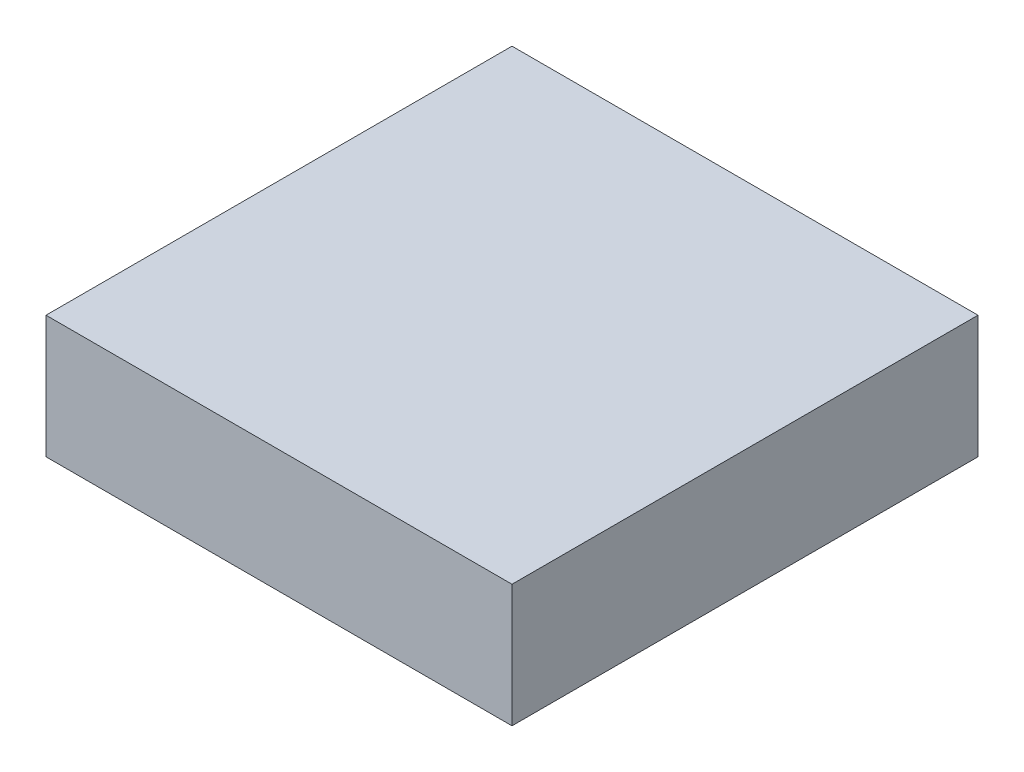
ISO-10303-21;
HEADER;
FILE_DESCRIPTION(('STEP AP214'),'2;1');
FILE_NAME('part.step','',(''),(''),'','','');
FILE_SCHEMA(('AUTOMOTIVE_DESIGN { 1 0 10303 214 1 1 1 1 }'));
ENDSEC;
DATA;
#1=APPLICATION_CONTEXT('core data for automotive mechanical design processes');
#2=APPLICATION_PROTOCOL_DEFINITION('international standard','automotive_design',2000,#1);
#3=PRODUCT_CONTEXT('',#1,'mechanical');
#4=PRODUCT('Part','Part','',(#3));
#5=PRODUCT_RELATED_PRODUCT_CATEGORY('part','',(#4));
#6=PRODUCT_DEFINITION_FORMATION('','',#4);
#7=PRODUCT_DEFINITION_CONTEXT('part definition',#1,'design');
#8=PRODUCT_DEFINITION('design','',#6,#7);
#9=PRODUCT_DEFINITION_SHAPE('','',#8);
#10=(LENGTH_UNIT() NAMED_UNIT(*) SI_UNIT(.MILLI.,.METRE.));
#11=(NAMED_UNIT(*) PLANE_ANGLE_UNIT() SI_UNIT($,.RADIAN.));
#12=(NAMED_UNIT(*) SI_UNIT($,.STERADIAN.) SOLID_ANGLE_UNIT());
#13=UNCERTAINTY_MEASURE_WITH_UNIT(LENGTH_MEASURE(1.E-05),#10,'distance_accuracy_value','');
#14=(GEOMETRIC_REPRESENTATION_CONTEXT(3) GLOBAL_UNCERTAINTY_ASSIGNED_CONTEXT((#13)) GLOBAL_UNIT_ASSIGNED_CONTEXT((#10,
#11,#12)) REPRESENTATION_CONTEXT('',''));
#15=CARTESIAN_POINT('',(0.,0.,0.));
#16=DIRECTION('',(0.,0.,1.));
#17=DIRECTION('',(1.,0.,0.));
#18=AXIS2_PLACEMENT_3D('',#15,#16,#17);
#19=CARTESIAN_POINT('',(28.5,15.,-28.5));
#20=DIRECTION('',(-1.,0.,0.));
#21=DIRECTION('',(0.,0.,1.));
#22=AXIS2_PLACEMENT_3D('',#19,#20,#21);
#23=PLANE('',#22);
#24=DIRECTION('',(0.,0.,-1.));
#25=VECTOR('',#24,1.);
#26=CARTESIAN_POINT('',(28.5,0.,-28.5));
#27=LINE('',#26,#25);
#28=CARTESIAN_POINT('',(28.5,0.,28.5));
#29=VERTEX_POINT('',#28);
#30=CARTESIAN_POINT('',(28.5,0.,-28.5));
#31=VERTEX_POINT('',#30);
#32=EDGE_CURVE('E107',#29,#31,#27,.T.);
#33=ORIENTED_EDGE('',*,*,#32,.T.);
#34=DIRECTION('',(0.,-1.,0.));
#35=VECTOR('',#34,1.);
#36=CARTESIAN_POINT('',(28.5,15.,-28.5));
#37=LINE('',#36,#35);
#38=CARTESIAN_POINT('',(28.5,15.,-28.5));
#39=VERTEX_POINT('',#38);
#40=EDGE_CURVE('E11',#39,#31,#37,.T.);
#41=ORIENTED_EDGE('',*,*,#40,.F.);
#42=DIRECTION('',(0.,0.,-1.));
#43=VECTOR('',#42,1.);
#44=CARTESIAN_POINT('',(28.5,15.,-28.5));
#45=LINE('',#44,#43);
#46=CARTESIAN_POINT('',(28.5,15.,28.5));
#47=VERTEX_POINT('',#46);
#48=EDGE_CURVE('E91',#47,#39,#45,.T.);
#49=ORIENTED_EDGE('',*,*,#48,.F.);
#50=DIRECTION('',(0.,-1.,0.));
#51=VECTOR('',#50,1.);
#52=CARTESIAN_POINT('',(28.5,15.,28.5));
#53=LINE('',#52,#51);
#54=EDGE_CURVE('E103',#47,#29,#53,.T.);
#55=ORIENTED_EDGE('',*,*,#54,.T.);
#56=EDGE_LOOP('',(#33,#41,#49,#55));
#57=FACE_BOUND('',#56,.T.);
#58=ADVANCED_FACE('F39',(#57),#23,.F.);
#59=CARTESIAN_POINT('',(-28.5,15.,-28.5));
#60=DIRECTION('',(0.,0.,1.));
#61=DIRECTION('',(1.,0.,0.));
#62=AXIS2_PLACEMENT_3D('',#59,#60,#61);
#63=PLANE('',#62);
#64=DIRECTION('',(-1.,0.,0.));
#65=VECTOR('',#64,1.);
#66=CARTESIAN_POINT('',(-28.5,0.,-28.5));
#67=LINE('',#66,#65);
#68=CARTESIAN_POINT('',(-28.5,0.,-28.5));
#69=VERTEX_POINT('',#68);
#70=EDGE_CURVE('E96',#31,#69,#67,.T.);
#71=ORIENTED_EDGE('',*,*,#70,.T.);
#72=DIRECTION('',(0.,-1.,0.));
#73=VECTOR('',#72,1.);
#74=CARTESIAN_POINT('',(-28.5,15.,-28.5));
#75=LINE('',#74,#73);
#76=CARTESIAN_POINT('',(-28.5,15.,-28.5));
#77=VERTEX_POINT('',#76);
#78=EDGE_CURVE('E48',#77,#69,#75,.T.);
#79=ORIENTED_EDGE('',*,*,#78,.F.);
#80=DIRECTION('',(-1.,0.,0.));
#81=VECTOR('',#80,1.);
#82=CARTESIAN_POINT('',(-28.5,15.,-28.5));
#83=LINE('',#82,#81);
#84=EDGE_CURVE('E86',#39,#77,#83,.T.);
#85=ORIENTED_EDGE('',*,*,#84,.F.);
#86=ORIENTED_EDGE('',*,*,#40,.T.);
#87=EDGE_LOOP('',(#71,#79,#85,#86));
#88=FACE_BOUND('',#87,.T.);
#89=ADVANCED_FACE('F95',(#88),#63,.F.);
#90=CARTESIAN_POINT('',(-28.5,15.,-28.5));
#91=DIRECTION('',(1.,0.,0.));
#92=DIRECTION('',(0.,0.,-1.));
#93=AXIS2_PLACEMENT_3D('',#90,#91,#92);
#94=PLANE('',#93);
#95=DIRECTION('',(0.,0.,1.));
#96=VECTOR('',#95,1.);
#97=CARTESIAN_POINT('',(-28.5,0.,-28.5));
#98=LINE('',#97,#96);
#99=CARTESIAN_POINT('',(-28.5,0.,28.5));
#100=VERTEX_POINT('',#99);
#101=EDGE_CURVE('E73',#69,#100,#98,.T.);
#102=ORIENTED_EDGE('',*,*,#101,.T.);
#103=DIRECTION('',(0.,-1.,0.));
#104=VECTOR('',#103,1.);
#105=CARTESIAN_POINT('',(-28.5,15.,28.5));
#106=LINE('',#105,#104);
#107=CARTESIAN_POINT('',(-28.5,15.,28.5));
#108=VERTEX_POINT('',#107);
#109=EDGE_CURVE('E98',#108,#100,#106,.T.);
#110=ORIENTED_EDGE('',*,*,#109,.F.);
#111=DIRECTION('',(0.,0.,1.));
#112=VECTOR('',#111,1.);
#113=CARTESIAN_POINT('',(-28.5,15.,-28.5));
#114=LINE('',#113,#112);
#115=EDGE_CURVE('E89',#77,#108,#114,.T.);
#116=ORIENTED_EDGE('',*,*,#115,.F.);
#117=ORIENTED_EDGE('',*,*,#78,.T.);
#118=EDGE_LOOP('',(#102,#110,#116,#117));
#119=FACE_BOUND('',#118,.T.);
#120=ADVANCED_FACE('F99',(#119),#94,.F.);
#121=CARTESIAN_POINT('',(-28.5,15.,28.5));
#122=DIRECTION('',(0.,0.,-1.));
#123=DIRECTION('',(-1.,0.,0.));
#124=AXIS2_PLACEMENT_3D('',#121,#122,#123);
#125=PLANE('',#124);
#126=DIRECTION('',(1.,0.,0.));
#127=VECTOR('',#126,1.);
#128=CARTESIAN_POINT('',(-28.5,0.,28.5));
#129=LINE('',#128,#127);
#130=EDGE_CURVE('E79',#100,#29,#129,.T.);
#131=ORIENTED_EDGE('',*,*,#130,.T.);
#132=ORIENTED_EDGE('',*,*,#54,.F.);
#133=DIRECTION('',(1.,0.,0.));
#134=VECTOR('',#133,1.);
#135=CARTESIAN_POINT('',(-28.5,15.,28.5));
#136=LINE('',#135,#134);
#137=EDGE_CURVE('E56',#108,#47,#136,.T.);
#138=ORIENTED_EDGE('',*,*,#137,.F.);
#139=ORIENTED_EDGE('',*,*,#109,.T.);
#140=EDGE_LOOP('',(#131,#132,#138,#139));
#141=FACE_BOUND('',#140,.T.);
#142=ADVANCED_FACE('F120',(#141),#125,.F.);
#143=CARTESIAN_POINT('',(0.,15.,0.));
#144=DIRECTION('',(0.,1.,0.));
#145=DIRECTION('',(0.,0.,1.));
#146=AXIS2_PLACEMENT_3D('',#143,#144,#145);
#147=PLANE('',#146);
#148=ORIENTED_EDGE('',*,*,#48,.T.);
#149=ORIENTED_EDGE('',*,*,#84,.T.);
#150=ORIENTED_EDGE('',*,*,#115,.T.);
#151=ORIENTED_EDGE('',*,*,#137,.T.);
#152=EDGE_LOOP('',(#148,#149,#150,#151));
#153=FACE_BOUND('',#152,.T.);
#154=ADVANCED_FACE('F87',(#153),#147,.T.);
#155=CARTESIAN_POINT('',(0.,0.,0.));
#156=DIRECTION('',(0.,1.,0.));
#157=DIRECTION('',(0.,0.,1.));
#158=AXIS2_PLACEMENT_3D('',#155,#156,#157);
#159=PLANE('',#158);
#160=ORIENTED_EDGE('',*,*,#32,.F.);
#161=ORIENTED_EDGE('',*,*,#130,.F.);
#162=ORIENTED_EDGE('',*,*,#101,.F.);
#163=ORIENTED_EDGE('',*,*,#70,.F.);
#164=EDGE_LOOP('',(#160,#161,#162,#163));
#165=FACE_BOUND('',#164,.T.);
#166=ADVANCED_FACE('F123',(#165),#159,.F.);
#167=CLOSED_SHELL('',(#58,#89,#120,#142,#154,#166));
#168=MANIFOLD_SOLID_BREP('B2',#167);
#169=ADVANCED_BREP_SHAPE_REPRESENTATION('',(#18,#168),#14);
#170=SHAPE_DEFINITION_REPRESENTATION(#9,#169);
ENDSEC;
END-ISO-10303-21;
